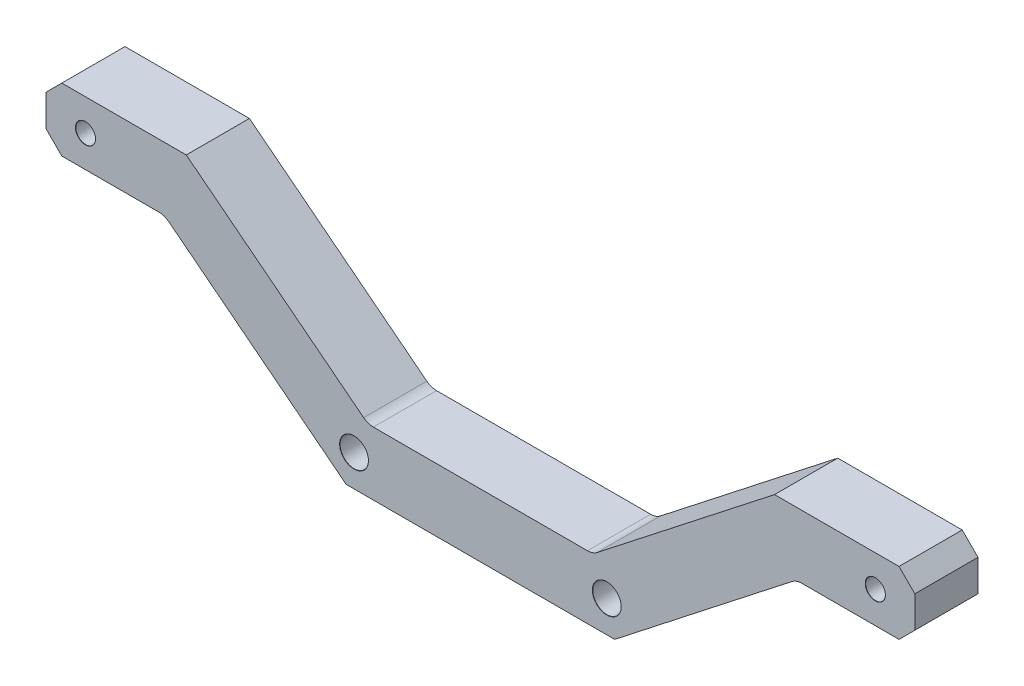
ISO-10303-21;
HEADER;
FILE_DESCRIPTION(('STEP AP214'),'2;1');
FILE_NAME('part.step','',(''),(''),'','','');
FILE_SCHEMA(('AUTOMOTIVE_DESIGN { 1 0 10303 214 1 1 1 1 }'));
ENDSEC;
DATA;
#1=APPLICATION_CONTEXT('core data for automotive mechanical design processes');
#2=APPLICATION_PROTOCOL_DEFINITION('international standard','automotive_design',2000,#1);
#3=PRODUCT_CONTEXT('',#1,'mechanical');
#4=PRODUCT('Part','Part','',(#3));
#5=PRODUCT_RELATED_PRODUCT_CATEGORY('part','',(#4));
#6=PRODUCT_DEFINITION_FORMATION('','',#4);
#7=PRODUCT_DEFINITION_CONTEXT('part definition',#1,'design');
#8=PRODUCT_DEFINITION('design','',#6,#7);
#9=PRODUCT_DEFINITION_SHAPE('','',#8);
#10=(LENGTH_UNIT() NAMED_UNIT(*) SI_UNIT(.MILLI.,.METRE.));
#11=(NAMED_UNIT(*) PLANE_ANGLE_UNIT() SI_UNIT($,.RADIAN.));
#12=(NAMED_UNIT(*) SI_UNIT($,.STERADIAN.) SOLID_ANGLE_UNIT());
#13=UNCERTAINTY_MEASURE_WITH_UNIT(LENGTH_MEASURE(1.E-05),#10,'distance_accuracy_value','');
#14=(GEOMETRIC_REPRESENTATION_CONTEXT(3) GLOBAL_UNCERTAINTY_ASSIGNED_CONTEXT((#13)) GLOBAL_UNIT_ASSIGNED_CONTEXT((#10,
#11,#12)) REPRESENTATION_CONTEXT('',''));
#15=CARTESIAN_POINT('',(0.,0.,0.));
#16=DIRECTION('',(0.,0.,1.));
#17=DIRECTION('',(1.,0.,0.));
#18=AXIS2_PLACEMENT_3D('',#15,#16,#17);
#19=CARTESIAN_POINT('',(0.,0.,0.));
#20=DIRECTION('',(0.,0.,-1.));
#21=DIRECTION('',(-1.,0.,0.));
#22=AXIS2_PLACEMENT_3D('',#19,#20,#21);
#23=PLANE('',#22);
#24=CARTESIAN_POINT('',(-16.,0.,0.));
#25=DIRECTION('',(0.,0.,1.));
#26=DIRECTION('',(1.,0.,0.));
#27=AXIS2_PLACEMENT_3D('',#24,#25,#26);
#28=CIRCLE('',#27,1.8);
#29=CARTESIAN_POINT('',(-14.2,0.,0.));
#30=VERTEX_POINT('',#29);
#31=EDGE_CURVE('E552',#30,#30,#28,.T.);
#32=ORIENTED_EDGE('',*,*,#31,.T.);
#33=EDGE_LOOP('',(#32));
#34=FACE_BOUND('',#33,.T.);
#35=CARTESIAN_POINT('',(16.,0.,0.));
#36=DIRECTION('',(0.,0.,1.));
#37=DIRECTION('',(1.,0.,0.));
#38=AXIS2_PLACEMENT_3D('',#35,#36,#37);
#39=CIRCLE('',#38,1.8);
#40=CARTESIAN_POINT('',(17.8,0.,0.));
#41=VERTEX_POINT('',#40);
#42=EDGE_CURVE('E540',#41,#41,#39,.T.);
#43=ORIENTED_EDGE('',*,*,#42,.T.);
#44=EDGE_LOOP('',(#43));
#45=FACE_BOUND('',#44,.T.);
#46=CARTESIAN_POINT('',(50.,18.,0.));
#47=DIRECTION('',(0.,0.,1.));
#48=DIRECTION('',(1.,0.,0.));
#49=AXIS2_PLACEMENT_3D('',#46,#47,#48);
#50=CIRCLE('',#49,1.25);
#51=CARTESIAN_POINT('',(51.25,18.,0.));
#52=VERTEX_POINT('',#51);
#53=EDGE_CURVE('E528',#52,#52,#50,.T.);
#54=ORIENTED_EDGE('',*,*,#53,.T.);
#55=EDGE_LOOP('',(#54));
#56=FACE_BOUND('',#55,.T.);
#57=DIRECTION('',(1.,0.,0.));
#58=VECTOR('',#57,1.);
#59=CARTESIAN_POINT('',(-55.,14.,0.));
#60=LINE('',#59,#58);
#61=CARTESIAN_POINT('',(-53.,14.,0.));
#62=VERTEX_POINT('',#61);
#63=CARTESIAN_POINT('',(-40.6895737481134,14.,0.));
#64=VERTEX_POINT('',#63);
#65=EDGE_CURVE('E252',#62,#64,#60,.T.);
#66=ORIENTED_EDGE('',*,*,#65,.F.);
#67=DIRECTION('',(0.707106781186545,-0.70710678118655,0.));
#68=VECTOR('',#67,1.);
#69=CARTESIAN_POINT('',(-19.5000000000002,-19.5,0.));
#70=LINE('',#69,#68);
#71=CARTESIAN_POINT('',(-55.,16.,0.));
#72=VERTEX_POINT('',#71);
#73=EDGE_CURVE('E300',#62,#72,#70,.F.);
#74=ORIENTED_EDGE('',*,*,#73,.T.);
#75=DIRECTION('',(0.,-1.,0.));
#76=VECTOR('',#75,1.);
#77=CARTESIAN_POINT('',(-55.,22.,0.));
#78=LINE('',#77,#76);
#79=CARTESIAN_POINT('',(-55.,20.,0.));
#80=VERTEX_POINT('',#79);
#81=EDGE_CURVE('E248',#80,#72,#78,.T.);
#82=ORIENTED_EDGE('',*,*,#81,.F.);
#83=DIRECTION('',(-0.70710678118655,-0.707106781186545,0.));
#84=VECTOR('',#83,1.);
#85=CARTESIAN_POINT('',(-37.4999999999998,37.5000000000001,0.));
#86=LINE('',#85,#84);
#87=CARTESIAN_POINT('',(-53.,22.,0.));
#88=VERTEX_POINT('',#87);
#89=EDGE_CURVE('E297',#80,#88,#86,.F.);
#90=ORIENTED_EDGE('',*,*,#89,.T.);
#91=DIRECTION('',(-1.,0.,0.));
#92=VECTOR('',#91,1.);
#93=CARTESIAN_POINT('',(-37.2417050075464,22.,0.));
#94=LINE('',#93,#92);
#95=CARTESIAN_POINT('',(-37.2417050075464,22.,0.));
#96=VERTEX_POINT('',#95);
#97=EDGE_CURVE('E245',#96,#88,#94,.T.);
#98=ORIENTED_EDGE('',*,*,#97,.F.);
#99=DIRECTION('',(-0.787505001007586,0.61630826165811,0.));
#100=VECTOR('',#99,1.);
#101=CARTESIAN_POINT('',(-14.2417050075465,4.,0.));
#102=LINE('',#101,#100);
#103=CARTESIAN_POINT('',(-14.7847477827493,4.42498999798483,0.));
#104=VERTEX_POINT('',#103);
#105=EDGE_CURVE('E191',#104,#96,#102,.T.);
#106=ORIENTED_EDGE('',*,*,#105,.F.);
#107=CARTESIAN_POINT('',(-13.5521312594331,6.,0.));
#108=DIRECTION('',(0.,0.,-1.));
#109=DIRECTION('',(-1.,0.,0.));
#110=AXIS2_PLACEMENT_3D('',#107,#108,#109);
#111=CIRCLE('',#110,2.);
#112=CARTESIAN_POINT('',(-13.5521312594331,4.,0.));
#113=VERTEX_POINT('',#112);
#114=EDGE_CURVE('E50',#104,#113,#111,.F.);
#115=ORIENTED_EDGE('',*,*,#114,.T.);
#116=DIRECTION('',(-1.,0.,0.));
#117=VECTOR('',#116,1.);
#118=CARTESIAN_POINT('',(-14.2417050075465,4.,0.));
#119=LINE('',#118,#117);
#120=CARTESIAN_POINT('',(13.5521312594331,4.,0.));
#121=VERTEX_POINT('',#120);
#122=EDGE_CURVE('E238',#121,#113,#119,.T.);
#123=ORIENTED_EDGE('',*,*,#122,.F.);
#124=CARTESIAN_POINT('',(13.5521312594331,6.,0.));
#125=DIRECTION('',(0.,0.,-1.));
#126=DIRECTION('',(-1.,0.,0.));
#127=AXIS2_PLACEMENT_3D('',#124,#125,#126);
#128=CIRCLE('',#127,2.);
#129=CARTESIAN_POINT('',(14.7847477827493,4.42498999798483,0.));
#130=VERTEX_POINT('',#129);
#131=EDGE_CURVE('E378',#121,#130,#128,.F.);
#132=ORIENTED_EDGE('',*,*,#131,.T.);
#133=DIRECTION('',(-0.787505001007586,-0.616308261658111,0.));
#134=VECTOR('',#133,1.);
#135=CARTESIAN_POINT('',(14.2417050075465,4.,0.));
#136=LINE('',#135,#134);
#137=CARTESIAN_POINT('',(37.2417050075464,22.,0.));
#138=VERTEX_POINT('',#137);
#139=EDGE_CURVE('E234',#138,#130,#136,.T.);
#140=ORIENTED_EDGE('',*,*,#139,.F.);
#141=DIRECTION('',(-1.,0.,0.));
#142=VECTOR('',#141,1.);
#143=CARTESIAN_POINT('',(37.2417050075464,22.,0.));
#144=LINE('',#143,#142);
#145=CARTESIAN_POINT('',(53.,22.,0.));
#146=VERTEX_POINT('',#145);
#147=EDGE_CURVE('E273',#146,#138,#144,.T.);
#148=ORIENTED_EDGE('',*,*,#147,.F.);
#149=DIRECTION('',(-0.707106781186545,0.70710678118655,0.));
#150=VECTOR('',#149,1.);
#151=CARTESIAN_POINT('',(37.5000000000002,37.4999999999999,0.));
#152=LINE('',#151,#150);
#153=CARTESIAN_POINT('',(55.,20.,0.));
#154=VERTEX_POINT('',#153);
#155=EDGE_CURVE('E290',#146,#154,#152,.F.);
#156=ORIENTED_EDGE('',*,*,#155,.T.);
#157=DIRECTION('',(0.,1.,0.));
#158=VECTOR('',#157,1.);
#159=CARTESIAN_POINT('',(55.,22.,0.));
#160=LINE('',#159,#158);
#161=CARTESIAN_POINT('',(55.,16.,0.));
#162=VERTEX_POINT('',#161);
#163=EDGE_CURVE('E269',#162,#154,#160,.T.);
#164=ORIENTED_EDGE('',*,*,#163,.F.);
#165=DIRECTION('',(0.70710678118655,0.707106781186545,0.));
#166=VECTOR('',#165,1.);
#167=CARTESIAN_POINT('',(19.4999999999998,-19.5,0.));
#168=LINE('',#167,#166);
#169=CARTESIAN_POINT('',(53.,14.,0.));
#170=VERTEX_POINT('',#169);
#171=EDGE_CURVE('E293',#162,#170,#168,.F.);
#172=ORIENTED_EDGE('',*,*,#171,.T.);
#173=DIRECTION('',(1.,0.,0.));
#174=VECTOR('',#173,1.);
#175=CARTESIAN_POINT('',(55.,14.,0.));
#176=LINE('',#175,#174);
#177=CARTESIAN_POINT('',(40.6895737481134,14.,0.));
#178=VERTEX_POINT('',#177);
#179=EDGE_CURVE('E266',#178,#170,#176,.T.);
#180=ORIENTED_EDGE('',*,*,#179,.F.);
#181=CARTESIAN_POINT('',(40.6895737481134,12.,0.));
#182=DIRECTION('',(0.,0.,-1.));
#183=DIRECTION('',(-1.,0.,0.));
#184=AXIS2_PLACEMENT_3D('',#181,#182,#183);
#185=CIRCLE('',#184,2.);
#186=CARTESIAN_POINT('',(39.4569572247972,13.5750100020152,0.));
#187=VERTEX_POINT('',#186);
#188=EDGE_CURVE('E372',#178,#187,#185,.F.);
#189=ORIENTED_EDGE('',*,*,#188,.T.);
#190=DIRECTION('',(0.787505001007586,0.616308261658111,0.));
#191=VECTOR('',#190,1.);
#192=CARTESIAN_POINT('',(40.,14.,0.));
#193=LINE('',#192,#191);
#194=CARTESIAN_POINT('',(17.,-4.,0.));
#195=VERTEX_POINT('',#194);
#196=EDGE_CURVE('E262',#195,#187,#193,.T.);
#197=ORIENTED_EDGE('',*,*,#196,.F.);
#198=DIRECTION('',(1.,0.,0.));
#199=VECTOR('',#198,1.);
#200=CARTESIAN_POINT('',(17.,-4.,0.));
#201=LINE('',#200,#199);
#202=CARTESIAN_POINT('',(-17.,-4.,0.));
#203=VERTEX_POINT('',#202);
#204=EDGE_CURVE('E259',#203,#195,#201,.T.);
#205=ORIENTED_EDGE('',*,*,#204,.F.);
#206=DIRECTION('',(0.787505001007586,-0.61630826165811,0.));
#207=VECTOR('',#206,1.);
#208=CARTESIAN_POINT('',(-40.,14.,0.));
#209=LINE('',#208,#207);
#210=CARTESIAN_POINT('',(-39.4569572247972,13.5750100020152,0.));
#211=VERTEX_POINT('',#210);
#212=EDGE_CURVE('E256',#211,#203,#209,.T.);
#213=ORIENTED_EDGE('',*,*,#212,.F.);
#214=CARTESIAN_POINT('',(-40.6895737481134,12.,0.));
#215=DIRECTION('',(0.,0.,-1.));
#216=DIRECTION('',(-1.,0.,0.));
#217=AXIS2_PLACEMENT_3D('',#214,#215,#216);
#218=CIRCLE('',#217,2.);
#219=EDGE_CURVE('E366',#211,#64,#218,.F.);
#220=ORIENTED_EDGE('',*,*,#219,.T.);
#221=EDGE_LOOP('',(#66,#74,#82,#90,#98,#106,#115,#123,#132,#140,#148,#156,#164,#172,#180,#189,
#197,#205,#213,#220));
#222=FACE_BOUND('',#221,.T.);
#223=CARTESIAN_POINT('',(-50.,18.,0.));
#224=DIRECTION('',(0.,0.,1.));
#225=DIRECTION('',(1.,0.,0.));
#226=AXIS2_PLACEMENT_3D('',#223,#224,#225);
#227=CIRCLE('',#226,1.25);
#228=CARTESIAN_POINT('',(-48.75,18.,0.));
#229=VERTEX_POINT('',#228);
#230=EDGE_CURVE('E239',#229,#229,#227,.T.);
#231=ORIENTED_EDGE('',*,*,#230,.T.);
#232=EDGE_LOOP('',(#231));
#233=FACE_BOUND('',#232,.T.);
#234=ADVANCED_FACE('F41',(#34,#45,#56,#222,#233),#23,.T.);
#235=CARTESIAN_POINT('',(0.,0.,8.));
#236=DIRECTION('',(0.,0.,-1.));
#237=DIRECTION('',(-1.,0.,0.));
#238=AXIS2_PLACEMENT_3D('',#235,#236,#237);
#239=PLANE('',#238);
#240=CARTESIAN_POINT('',(-16.,0.,8.));
#241=DIRECTION('',(0.,0.,1.));
#242=DIRECTION('',(1.,0.,0.));
#243=AXIS2_PLACEMENT_3D('',#240,#241,#242);
#244=CIRCLE('',#243,1.825);
#245=CARTESIAN_POINT('',(-14.175,0.,8.));
#246=VERTEX_POINT('',#245);
#247=EDGE_CURVE('E559',#246,#246,#244,.T.);
#248=ORIENTED_EDGE('',*,*,#247,.F.);
#249=EDGE_LOOP('',(#248));
#250=FACE_BOUND('',#249,.T.);
#251=CARTESIAN_POINT('',(16.,0.,8.));
#252=DIRECTION('',(0.,0.,1.));
#253=DIRECTION('',(1.,0.,0.));
#254=AXIS2_PLACEMENT_3D('',#251,#252,#253);
#255=CIRCLE('',#254,1.825);
#256=CARTESIAN_POINT('',(17.825,0.,8.));
#257=VERTEX_POINT('',#256);
#258=EDGE_CURVE('E548',#257,#257,#255,.T.);
#259=ORIENTED_EDGE('',*,*,#258,.F.);
#260=EDGE_LOOP('',(#259));
#261=FACE_BOUND('',#260,.T.);
#262=CARTESIAN_POINT('',(50.,18.,8.));
#263=DIRECTION('',(0.,0.,1.));
#264=DIRECTION('',(1.,0.,0.));
#265=AXIS2_PLACEMENT_3D('',#262,#263,#264);
#266=CIRCLE('',#265,1.275);
#267=CARTESIAN_POINT('',(51.275,18.,8.));
#268=VERTEX_POINT('',#267);
#269=EDGE_CURVE('E536',#268,#268,#266,.T.);
#270=ORIENTED_EDGE('',*,*,#269,.F.);
#271=EDGE_LOOP('',(#270));
#272=FACE_BOUND('',#271,.T.);
#273=CARTESIAN_POINT('',(-50.,18.,8.));
#274=DIRECTION('',(0.,0.,1.));
#275=DIRECTION('',(1.,0.,0.));
#276=AXIS2_PLACEMENT_3D('',#273,#274,#275);
#277=CIRCLE('',#276,1.275);
#278=CARTESIAN_POINT('',(-48.725,18.,8.));
#279=VERTEX_POINT('',#278);
#280=EDGE_CURVE('E524',#279,#279,#277,.T.);
#281=ORIENTED_EDGE('',*,*,#280,.F.);
#282=EDGE_LOOP('',(#281));
#283=FACE_BOUND('',#282,.T.);
#284=DIRECTION('',(0.,-1.,0.));
#285=VECTOR('',#284,1.);
#286=CARTESIAN_POINT('',(-55.,22.,8.));
#287=LINE('',#286,#285);
#288=CARTESIAN_POINT('',(-55.,20.,8.));
#289=VERTEX_POINT('',#288);
#290=CARTESIAN_POINT('',(-55.,16.,8.));
#291=VERTEX_POINT('',#290);
#292=EDGE_CURVE('E203',#289,#291,#287,.T.);
#293=ORIENTED_EDGE('',*,*,#292,.T.);
#294=DIRECTION('',(-0.707106781186545,0.70710678118655,0.));
#295=VECTOR('',#294,1.);
#296=CARTESIAN_POINT('',(-53.,14.,8.));
#297=LINE('',#296,#295);
#298=CARTESIAN_POINT('',(-53.,14.,8.));
#299=VERTEX_POINT('',#298);
#300=EDGE_CURVE('E319',#291,#299,#297,.F.);
#301=ORIENTED_EDGE('',*,*,#300,.T.);
#302=DIRECTION('',(1.,0.,0.));
#303=VECTOR('',#302,1.);
#304=CARTESIAN_POINT('',(-55.,14.,8.));
#305=LINE('',#304,#303);
#306=CARTESIAN_POINT('',(-40.6895737481134,14.,8.));
#307=VERTEX_POINT('',#306);
#308=EDGE_CURVE('E206',#299,#307,#305,.T.);
#309=ORIENTED_EDGE('',*,*,#308,.T.);
#310=CARTESIAN_POINT('',(-40.6895737481134,12.,8.));
#311=DIRECTION('',(0.,0.,-1.));
#312=DIRECTION('',(-1.,0.,0.));
#313=AXIS2_PLACEMENT_3D('',#310,#311,#312);
#314=CIRCLE('',#313,2.);
#315=CARTESIAN_POINT('',(-39.4569572247972,13.5750100020152,8.));
#316=VERTEX_POINT('',#315);
#317=EDGE_CURVE('E369',#307,#316,#314,.T.);
#318=ORIENTED_EDGE('',*,*,#317,.T.);
#319=DIRECTION('',(0.787505001007586,-0.61630826165811,0.));
#320=VECTOR('',#319,1.);
#321=CARTESIAN_POINT('',(-40.,14.,8.));
#322=LINE('',#321,#320);
#323=CARTESIAN_POINT('',(-17.,-4.,8.));
#324=VERTEX_POINT('',#323);
#325=EDGE_CURVE('E213',#316,#324,#322,.T.);
#326=ORIENTED_EDGE('',*,*,#325,.T.);
#327=DIRECTION('',(1.,0.,0.));
#328=VECTOR('',#327,1.);
#329=CARTESIAN_POINT('',(17.,-4.,8.));
#330=LINE('',#329,#328);
#331=CARTESIAN_POINT('',(17.,-4.,8.));
#332=VERTEX_POINT('',#331);
#333=EDGE_CURVE('E216',#324,#332,#330,.T.);
#334=ORIENTED_EDGE('',*,*,#333,.T.);
#335=DIRECTION('',(0.787505001007586,0.616308261658111,0.));
#336=VECTOR('',#335,1.);
#337=CARTESIAN_POINT('',(40.,14.,8.));
#338=LINE('',#337,#336);
#339=CARTESIAN_POINT('',(39.4569572247972,13.5750100020152,8.));
#340=VERTEX_POINT('',#339);
#341=EDGE_CURVE('E219',#332,#340,#338,.T.);
#342=ORIENTED_EDGE('',*,*,#341,.T.);
#343=CARTESIAN_POINT('',(40.6895737481134,12.,8.));
#344=DIRECTION('',(0.,0.,-1.));
#345=DIRECTION('',(-1.,0.,0.));
#346=AXIS2_PLACEMENT_3D('',#343,#344,#345);
#347=CIRCLE('',#346,2.);
#348=CARTESIAN_POINT('',(40.6895737481134,14.,8.));
#349=VERTEX_POINT('',#348);
#350=EDGE_CURVE('E375',#340,#349,#347,.T.);
#351=ORIENTED_EDGE('',*,*,#350,.T.);
#352=DIRECTION('',(1.,0.,0.));
#353=VECTOR('',#352,1.);
#354=CARTESIAN_POINT('',(55.,14.,8.));
#355=LINE('',#354,#353);
#356=CARTESIAN_POINT('',(53.,14.,8.));
#357=VERTEX_POINT('',#356);
#358=EDGE_CURVE('E223',#349,#357,#355,.T.);
#359=ORIENTED_EDGE('',*,*,#358,.T.);
#360=DIRECTION('',(-0.70710678118655,-0.707106781186545,0.));
#361=VECTOR('',#360,1.);
#362=CARTESIAN_POINT('',(55.,16.,8.));
#363=LINE('',#362,#361);
#364=CARTESIAN_POINT('',(55.,16.,8.));
#365=VERTEX_POINT('',#364);
#366=EDGE_CURVE('E313',#357,#365,#363,.F.);
#367=ORIENTED_EDGE('',*,*,#366,.T.);
#368=DIRECTION('',(0.,1.,0.));
#369=VECTOR('',#368,1.);
#370=CARTESIAN_POINT('',(55.,22.,8.));
#371=LINE('',#370,#369);
#372=CARTESIAN_POINT('',(55.,20.,8.));
#373=VERTEX_POINT('',#372);
#374=EDGE_CURVE('E226',#365,#373,#371,.T.);
#375=ORIENTED_EDGE('',*,*,#374,.T.);
#376=DIRECTION('',(0.707106781186545,-0.70710678118655,0.));
#377=VECTOR('',#376,1.);
#378=CARTESIAN_POINT('',(53.,22.,8.));
#379=LINE('',#378,#377);
#380=CARTESIAN_POINT('',(53.,22.,8.));
#381=VERTEX_POINT('',#380);
#382=EDGE_CURVE('E310',#373,#381,#379,.F.);
#383=ORIENTED_EDGE('',*,*,#382,.T.);
#384=DIRECTION('',(-1.,0.,0.));
#385=VECTOR('',#384,1.);
#386=CARTESIAN_POINT('',(37.2417050075464,22.,8.));
#387=LINE('',#386,#385);
#388=CARTESIAN_POINT('',(37.2417050075464,22.,8.));
#389=VERTEX_POINT('',#388);
#390=EDGE_CURVE('E230',#381,#389,#387,.T.);
#391=ORIENTED_EDGE('',*,*,#390,.T.);
#392=DIRECTION('',(-0.787505001007586,-0.616308261658111,0.));
#393=VECTOR('',#392,1.);
#394=CARTESIAN_POINT('',(14.2417050075465,4.,8.));
#395=LINE('',#394,#393);
#396=CARTESIAN_POINT('',(14.7847477827493,4.42498999798483,8.));
#397=VERTEX_POINT('',#396);
#398=EDGE_CURVE('E276',#389,#397,#395,.T.);
#399=ORIENTED_EDGE('',*,*,#398,.T.);
#400=CARTESIAN_POINT('',(13.5521312594331,6.,8.));
#401=DIRECTION('',(0.,0.,-1.));
#402=DIRECTION('',(-1.,0.,0.));
#403=AXIS2_PLACEMENT_3D('',#400,#401,#402);
#404=CIRCLE('',#403,2.);
#405=CARTESIAN_POINT('',(13.5521312594331,4.,8.));
#406=VERTEX_POINT('',#405);
#407=EDGE_CURVE('E381',#397,#406,#404,.T.);
#408=ORIENTED_EDGE('',*,*,#407,.T.);
#409=DIRECTION('',(-1.,0.,0.));
#410=VECTOR('',#409,1.);
#411=CARTESIAN_POINT('',(-14.2417050075465,4.,8.));
#412=LINE('',#411,#410);
#413=CARTESIAN_POINT('',(-13.5521312594331,4.,8.));
#414=VERTEX_POINT('',#413);
#415=EDGE_CURVE('E185',#406,#414,#412,.T.);
#416=ORIENTED_EDGE('',*,*,#415,.T.);
#417=CARTESIAN_POINT('',(-13.5521312594331,6.,8.));
#418=DIRECTION('',(0.,0.,-1.));
#419=DIRECTION('',(-1.,0.,0.));
#420=AXIS2_PLACEMENT_3D('',#417,#418,#419);
#421=CIRCLE('',#420,2.);
#422=CARTESIAN_POINT('',(-14.7847477827493,4.42498999798483,8.));
#423=VERTEX_POINT('',#422);
#424=EDGE_CURVE('E11',#414,#423,#421,.T.);
#425=ORIENTED_EDGE('',*,*,#424,.T.);
#426=DIRECTION('',(-0.787505001007586,0.61630826165811,0.));
#427=VECTOR('',#426,1.);
#428=CARTESIAN_POINT('',(-14.2417050075465,4.,8.));
#429=LINE('',#428,#427);
#430=CARTESIAN_POINT('',(-37.2417050075464,22.,8.));
#431=VERTEX_POINT('',#430);
#432=EDGE_CURVE('E176',#423,#431,#429,.T.);
#433=ORIENTED_EDGE('',*,*,#432,.T.);
#434=DIRECTION('',(-1.,0.,0.));
#435=VECTOR('',#434,1.);
#436=CARTESIAN_POINT('',(-37.2417050075464,22.,8.));
#437=LINE('',#436,#435);
#438=CARTESIAN_POINT('',(-53.,22.,8.));
#439=VERTEX_POINT('',#438);
#440=EDGE_CURVE('E181',#431,#439,#437,.T.);
#441=ORIENTED_EDGE('',*,*,#440,.T.);
#442=DIRECTION('',(0.70710678118655,0.707106781186545,0.));
#443=VECTOR('',#442,1.);
#444=CARTESIAN_POINT('',(-55.,20.,8.));
#445=LINE('',#444,#443);
#446=EDGE_CURVE('E316',#439,#289,#445,.F.);
#447=ORIENTED_EDGE('',*,*,#446,.T.);
#448=EDGE_LOOP('',(#293,#301,#309,#318,#326,#334,#342,#351,#359,#367,#375,#383,#391,#399,#408,
#416,#425,#433,#441,#447));
#449=FACE_BOUND('',#448,.T.);
#450=ADVANCED_FACE('F179',(#250,#261,#272,#283,#449),#239,.F.);
#451=CARTESIAN_POINT('',(14.2417050075465,4.,8.));
#452=DIRECTION('',(0.616308261658111,-0.787505001007586,0.));
#453=DIRECTION('',(0.787505001007586,0.616308261658111,0.));
#454=AXIS2_PLACEMENT_3D('',#451,#452,#453);
#455=PLANE('',#454);
#456=ORIENTED_EDGE('',*,*,#139,.T.);
#457=DIRECTION('',(0.,0.,-1.));
#458=VECTOR('',#457,1.);
#459=CARTESIAN_POINT('',(14.7847477827493,4.42498999798483,8.));
#460=LINE('',#459,#458);
#461=EDGE_CURVE('E360',#130,#397,#460,.F.);
#462=ORIENTED_EDGE('',*,*,#461,.T.);
#463=ORIENTED_EDGE('',*,*,#398,.F.);
#464=DIRECTION('',(0.,0.,-1.));
#465=VECTOR('',#464,1.);
#466=CARTESIAN_POINT('',(37.2417050075464,22.,8.));
#467=LINE('',#466,#465);
#468=EDGE_CURVE('E233',#389,#138,#467,.T.);
#469=ORIENTED_EDGE('',*,*,#468,.T.);
#470=EDGE_LOOP('',(#456,#462,#463,#469));
#471=FACE_BOUND('',#470,.T.);
#472=ADVANCED_FACE('F405',(#471),#455,.F.);
#473=CARTESIAN_POINT('',(-14.2417050075465,4.,8.));
#474=DIRECTION('',(0.,-1.,0.));
#475=DIRECTION('',(1.,0.,0.));
#476=AXIS2_PLACEMENT_3D('',#473,#474,#475);
#477=PLANE('',#476);
#478=ORIENTED_EDGE('',*,*,#415,.F.);
#479=DIRECTION('',(0.,0.,-1.));
#480=VECTOR('',#479,1.);
#481=CARTESIAN_POINT('',(13.5521312594331,4.,0.));
#482=LINE('',#481,#480);
#483=EDGE_CURVE('E356',#406,#121,#482,.T.);
#484=ORIENTED_EDGE('',*,*,#483,.T.);
#485=ORIENTED_EDGE('',*,*,#122,.T.);
#486=DIRECTION('',(0.,0.,-1.));
#487=VECTOR('',#486,1.);
#488=CARTESIAN_POINT('',(-13.5521312594331,4.,8.));
#489=LINE('',#488,#487);
#490=EDGE_CURVE('E353',#113,#414,#489,.F.);
#491=ORIENTED_EDGE('',*,*,#490,.T.);
#492=EDGE_LOOP('',(#478,#484,#485,#491));
#493=FACE_BOUND('',#492,.T.);
#494=ADVANCED_FACE('F390',(#493),#477,.F.);
#495=CARTESIAN_POINT('',(-14.2417050075465,4.,8.));
#496=DIRECTION('',(-0.61630826165811,-0.787505001007586,0.));
#497=DIRECTION('',(0.787505001007586,-0.616308261658111,0.));
#498=AXIS2_PLACEMENT_3D('',#495,#496,#497);
#499=PLANE('',#498);
#500=ORIENTED_EDGE('',*,*,#432,.F.);
#501=DIRECTION('',(0.,0.,-1.));
#502=VECTOR('',#501,1.);
#503=CARTESIAN_POINT('',(-14.7847477827493,4.42498999798483,0.));
#504=LINE('',#503,#502);
#505=EDGE_CURVE('E363',#423,#104,#504,.T.);
#506=ORIENTED_EDGE('',*,*,#505,.T.);
#507=ORIENTED_EDGE('',*,*,#105,.T.);
#508=DIRECTION('',(0.,0.,-1.));
#509=VECTOR('',#508,1.);
#510=CARTESIAN_POINT('',(-37.2417050075464,22.,8.));
#511=LINE('',#510,#509);
#512=EDGE_CURVE('E188',#431,#96,#511,.T.);
#513=ORIENTED_EDGE('',*,*,#512,.F.);
#514=EDGE_LOOP('',(#500,#506,#507,#513));
#515=FACE_BOUND('',#514,.T.);
#516=ADVANCED_FACE('F189',(#515),#499,.F.);
#517=CARTESIAN_POINT('',(-37.2417050075464,22.,8.));
#518=DIRECTION('',(0.,-1.,0.));
#519=DIRECTION('',(1.,0.,0.));
#520=AXIS2_PLACEMENT_3D('',#517,#518,#519);
#521=PLANE('',#520);
#522=ORIENTED_EDGE('',*,*,#97,.T.);
#523=DIRECTION('',(0.,0.,1.));
#524=VECTOR('',#523,1.);
#525=CARTESIAN_POINT('',(-53.,22.,8.));
#526=LINE('',#525,#524);
#527=EDGE_CURVE('E201',#88,#439,#526,.T.);
#528=ORIENTED_EDGE('',*,*,#527,.T.);
#529=ORIENTED_EDGE('',*,*,#440,.F.);
#530=ORIENTED_EDGE('',*,*,#512,.T.);
#531=EDGE_LOOP('',(#522,#528,#529,#530));
#532=FACE_BOUND('',#531,.T.);
#533=ADVANCED_FACE('F199',(#532),#521,.F.);
#534=CARTESIAN_POINT('',(-55.,22.,8.));
#535=DIRECTION('',(1.,0.,0.));
#536=DIRECTION('',(0.,0.,-1.));
#537=AXIS2_PLACEMENT_3D('',#534,#535,#536);
#538=PLANE('',#537);
#539=ORIENTED_EDGE('',*,*,#81,.T.);
#540=DIRECTION('',(0.,0.,1.));
#541=VECTOR('',#540,1.);
#542=CARTESIAN_POINT('',(-55.,16.,8.));
#543=LINE('',#542,#541);
#544=EDGE_CURVE('E307',#72,#291,#543,.T.);
#545=ORIENTED_EDGE('',*,*,#544,.T.);
#546=ORIENTED_EDGE('',*,*,#292,.F.);
#547=DIRECTION('',(0.,0.,-1.));
#548=VECTOR('',#547,1.);
#549=CARTESIAN_POINT('',(-55.,20.,8.));
#550=LINE('',#549,#548);
#551=EDGE_CURVE('E303',#289,#80,#550,.T.);
#552=ORIENTED_EDGE('',*,*,#551,.T.);
#553=EDGE_LOOP('',(#539,#545,#546,#552));
#554=FACE_BOUND('',#553,.T.);
#555=ADVANCED_FACE('F440',(#554),#538,.F.);
#556=CARTESIAN_POINT('',(-55.,14.,8.));
#557=DIRECTION('',(0.,1.,0.));
#558=DIRECTION('',(-1.,0.,0.));
#559=AXIS2_PLACEMENT_3D('',#556,#557,#558);
#560=PLANE('',#559);
#561=ORIENTED_EDGE('',*,*,#65,.T.);
#562=DIRECTION('',(0.,0.,-1.));
#563=VECTOR('',#562,1.);
#564=CARTESIAN_POINT('',(-40.6895737481134,14.,8.));
#565=LINE('',#564,#563);
#566=EDGE_CURVE('E343',#64,#307,#565,.F.);
#567=ORIENTED_EDGE('',*,*,#566,.T.);
#568=ORIENTED_EDGE('',*,*,#308,.F.);
#569=DIRECTION('',(0.,0.,-1.));
#570=VECTOR('',#569,1.);
#571=CARTESIAN_POINT('',(-53.,14.,8.));
#572=LINE('',#571,#570);
#573=EDGE_CURVE('E196',#299,#62,#572,.T.);
#574=ORIENTED_EDGE('',*,*,#573,.T.);
#575=EDGE_LOOP('',(#561,#567,#568,#574));
#576=FACE_BOUND('',#575,.T.);
#577=ADVANCED_FACE('F436',(#576),#560,.F.);
#578=CARTESIAN_POINT('',(-40.,14.,8.));
#579=DIRECTION('',(0.61630826165811,0.787505001007586,0.));
#580=DIRECTION('',(-0.787505001007586,0.61630826165811,0.));
#581=AXIS2_PLACEMENT_3D('',#578,#579,#580);
#582=PLANE('',#581);
#583=ORIENTED_EDGE('',*,*,#325,.F.);
#584=DIRECTION('',(0.,0.,-1.));
#585=VECTOR('',#584,1.);
#586=CARTESIAN_POINT('',(-39.4569572247972,13.5750100020152,0.));
#587=LINE('',#586,#585);
#588=EDGE_CURVE('E339',#316,#211,#587,.T.);
#589=ORIENTED_EDGE('',*,*,#588,.T.);
#590=ORIENTED_EDGE('',*,*,#212,.T.);
#591=DIRECTION('',(0.,0.,-1.));
#592=VECTOR('',#591,1.);
#593=CARTESIAN_POINT('',(-17.,-4.,8.));
#594=LINE('',#593,#592);
#595=EDGE_CURVE('E197',#324,#203,#594,.T.);
#596=ORIENTED_EDGE('',*,*,#595,.F.);
#597=EDGE_LOOP('',(#583,#589,#590,#596));
#598=FACE_BOUND('',#597,.T.);
#599=ADVANCED_FACE('F432',(#598),#582,.F.);
#600=CARTESIAN_POINT('',(17.,-4.,8.));
#601=DIRECTION('',(0.,1.,0.));
#602=DIRECTION('',(-1.,0.,0.));
#603=AXIS2_PLACEMENT_3D('',#600,#601,#602);
#604=PLANE('',#603);
#605=ORIENTED_EDGE('',*,*,#204,.T.);
#606=DIRECTION('',(0.,0.,-1.));
#607=VECTOR('',#606,1.);
#608=CARTESIAN_POINT('',(17.,-4.,8.));
#609=LINE('',#608,#607);
#610=EDGE_CURVE('E280',#332,#195,#609,.T.);
#611=ORIENTED_EDGE('',*,*,#610,.F.);
#612=ORIENTED_EDGE('',*,*,#333,.F.);
#613=ORIENTED_EDGE('',*,*,#595,.T.);
#614=EDGE_LOOP('',(#605,#611,#612,#613));
#615=FACE_BOUND('',#614,.T.);
#616=ADVANCED_FACE('F428',(#615),#604,.F.);
#617=CARTESIAN_POINT('',(40.,14.,8.));
#618=DIRECTION('',(-0.616308261658111,0.787505001007586,0.));
#619=DIRECTION('',(-0.787505001007586,-0.616308261658111,0.));
#620=AXIS2_PLACEMENT_3D('',#617,#618,#619);
#621=PLANE('',#620);
#622=ORIENTED_EDGE('',*,*,#196,.T.);
#623=DIRECTION('',(0.,0.,-1.));
#624=VECTOR('',#623,1.);
#625=CARTESIAN_POINT('',(39.4569572247972,13.5750100020152,8.));
#626=LINE('',#625,#624);
#627=EDGE_CURVE('E350',#187,#340,#626,.F.);
#628=ORIENTED_EDGE('',*,*,#627,.T.);
#629=ORIENTED_EDGE('',*,*,#341,.F.);
#630=ORIENTED_EDGE('',*,*,#610,.T.);
#631=EDGE_LOOP('',(#622,#628,#629,#630));
#632=FACE_BOUND('',#631,.T.);
#633=ADVANCED_FACE('F424',(#632),#621,.F.);
#634=CARTESIAN_POINT('',(55.,14.,8.));
#635=DIRECTION('',(0.,1.,0.));
#636=DIRECTION('',(-1.,0.,0.));
#637=AXIS2_PLACEMENT_3D('',#634,#635,#636);
#638=PLANE('',#637);
#639=ORIENTED_EDGE('',*,*,#358,.F.);
#640=DIRECTION('',(0.,0.,-1.));
#641=VECTOR('',#640,1.);
#642=CARTESIAN_POINT('',(40.6895737481134,14.,0.));
#643=LINE('',#642,#641);
#644=EDGE_CURVE('E346',#349,#178,#643,.T.);
#645=ORIENTED_EDGE('',*,*,#644,.T.);
#646=ORIENTED_EDGE('',*,*,#179,.T.);
#647=DIRECTION('',(0.,0.,1.));
#648=VECTOR('',#647,1.);
#649=CARTESIAN_POINT('',(53.,14.,8.));
#650=LINE('',#649,#648);
#651=EDGE_CURVE('E331',#170,#357,#650,.T.);
#652=ORIENTED_EDGE('',*,*,#651,.T.);
#653=EDGE_LOOP('',(#639,#645,#646,#652));
#654=FACE_BOUND('',#653,.T.);
#655=ADVANCED_FACE('F420',(#654),#638,.F.);
#656=CARTESIAN_POINT('',(55.,22.,8.));
#657=DIRECTION('',(-1.,0.,0.));
#658=DIRECTION('',(0.,0.,1.));
#659=AXIS2_PLACEMENT_3D('',#656,#657,#658);
#660=PLANE('',#659);
#661=ORIENTED_EDGE('',*,*,#374,.F.);
#662=DIRECTION('',(0.,0.,-1.));
#663=VECTOR('',#662,1.);
#664=CARTESIAN_POINT('',(55.,16.,8.));
#665=LINE('',#664,#663);
#666=EDGE_CURVE('E327',#365,#162,#665,.T.);
#667=ORIENTED_EDGE('',*,*,#666,.T.);
#668=ORIENTED_EDGE('',*,*,#163,.T.);
#669=DIRECTION('',(0.,0.,1.));
#670=VECTOR('',#669,1.);
#671=CARTESIAN_POINT('',(55.,20.,8.));
#672=LINE('',#671,#670);
#673=EDGE_CURVE('E324',#154,#373,#672,.T.);
#674=ORIENTED_EDGE('',*,*,#673,.T.);
#675=EDGE_LOOP('',(#661,#667,#668,#674));
#676=FACE_BOUND('',#675,.T.);
#677=ADVANCED_FACE('F416',(#676),#660,.F.);
#678=CARTESIAN_POINT('',(37.2417050075464,22.,8.));
#679=DIRECTION('',(0.,-1.,0.));
#680=DIRECTION('',(0.,0.,-1.));
#681=AXIS2_PLACEMENT_3D('',#678,#679,#680);
#682=PLANE('',#681);
#683=ORIENTED_EDGE('',*,*,#390,.F.);
#684=DIRECTION('',(0.,0.,-1.));
#685=VECTOR('',#684,1.);
#686=CARTESIAN_POINT('',(53.,22.,8.));
#687=LINE('',#686,#685);
#688=EDGE_CURVE('E335',#381,#146,#687,.T.);
#689=ORIENTED_EDGE('',*,*,#688,.T.);
#690=ORIENTED_EDGE('',*,*,#147,.T.);
#691=ORIENTED_EDGE('',*,*,#468,.F.);
#692=EDGE_LOOP('',(#683,#689,#690,#691));
#693=FACE_BOUND('',#692,.T.);
#694=ADVANCED_FACE('F412',(#693),#682,.F.);
#695=CARTESIAN_POINT('',(-50.,18.,8.));
#696=DIRECTION('',(0.,0.,1.));
#697=DIRECTION('',(1.,0.,0.));
#698=AXIS2_PLACEMENT_3D('',#695,#696,#697);
#699=CYLINDRICAL_SURFACE('',#698,1.25);
#700=ORIENTED_EDGE('',*,*,#230,.F.);
#701=EDGE_LOOP('',(#700));
#702=FACE_BOUND('',#701,.T.);
#703=CARTESIAN_POINT('',(-50.,18.,7.975));
#704=DIRECTION('',(0.,0.,1.));
#705=DIRECTION('',(1.,0.,0.));
#706=AXIS2_PLACEMENT_3D('',#703,#704,#705);
#707=CIRCLE('',#706,1.25);
#708=CARTESIAN_POINT('',(-48.75,18.,7.975));
#709=VERTEX_POINT('',#708);
#710=EDGE_CURVE('E520',#709,#709,#707,.T.);
#711=ORIENTED_EDGE('',*,*,#710,.T.);
#712=EDGE_LOOP('',(#711));
#713=FACE_BOUND('',#712,.T.);
#714=ADVANCED_FACE('F415',(#702,#713),#699,.F.);
#715=CARTESIAN_POINT('',(-50.,18.,8.));
#716=DIRECTION('',(0.,0.,1.));
#717=DIRECTION('',(1.,0.,0.));
#718=AXIS2_PLACEMENT_3D('',#715,#716,#717);
#719=CONICAL_SURFACE('',#718,1.275,0.785398163397344);
#720=ORIENTED_EDGE('',*,*,#710,.F.);
#721=EDGE_LOOP('',(#720));
#722=FACE_BOUND('',#721,.T.);
#723=ORIENTED_EDGE('',*,*,#280,.T.);
#724=EDGE_LOOP('',(#723));
#725=FACE_BOUND('',#724,.T.);
#726=ADVANCED_FACE('F571',(#722,#725),#719,.F.);
#727=CARTESIAN_POINT('',(50.,18.,8.));
#728=DIRECTION('',(0.,0.,1.));
#729=DIRECTION('',(1.,0.,0.));
#730=AXIS2_PLACEMENT_3D('',#727,#728,#729);
#731=CYLINDRICAL_SURFACE('',#730,1.25);
#732=ORIENTED_EDGE('',*,*,#53,.F.);
#733=EDGE_LOOP('',(#732));
#734=FACE_BOUND('',#733,.T.);
#735=CARTESIAN_POINT('',(50.,18.,7.975));
#736=DIRECTION('',(0.,0.,1.));
#737=DIRECTION('',(1.,0.,0.));
#738=AXIS2_PLACEMENT_3D('',#735,#736,#737);
#739=CIRCLE('',#738,1.25);
#740=CARTESIAN_POINT('',(51.25,18.,7.975));
#741=VERTEX_POINT('',#740);
#742=EDGE_CURVE('E532',#741,#741,#739,.T.);
#743=ORIENTED_EDGE('',*,*,#742,.T.);
#744=EDGE_LOOP('',(#743));
#745=FACE_BOUND('',#744,.T.);
#746=ADVANCED_FACE('F573',(#734,#745),#731,.F.);
#747=CARTESIAN_POINT('',(50.,18.,8.));
#748=DIRECTION('',(0.,0.,1.));
#749=DIRECTION('',(1.,0.,0.));
#750=AXIS2_PLACEMENT_3D('',#747,#748,#749);
#751=CONICAL_SURFACE('',#750,1.275,0.785398163397344);
#752=ORIENTED_EDGE('',*,*,#742,.F.);
#753=EDGE_LOOP('',(#752));
#754=FACE_BOUND('',#753,.T.);
#755=ORIENTED_EDGE('',*,*,#269,.T.);
#756=EDGE_LOOP('',(#755));
#757=FACE_BOUND('',#756,.T.);
#758=ADVANCED_FACE('F580',(#754,#757),#751,.F.);
#759=CARTESIAN_POINT('',(16.,0.,8.));
#760=DIRECTION('',(0.,0.,1.));
#761=DIRECTION('',(1.,0.,0.));
#762=AXIS2_PLACEMENT_3D('',#759,#760,#761);
#763=CYLINDRICAL_SURFACE('',#762,1.8);
#764=ORIENTED_EDGE('',*,*,#42,.F.);
#765=EDGE_LOOP('',(#764));
#766=FACE_BOUND('',#765,.T.);
#767=CARTESIAN_POINT('',(16.,0.,7.975));
#768=DIRECTION('',(0.,0.,1.));
#769=DIRECTION('',(1.,0.,0.));
#770=AXIS2_PLACEMENT_3D('',#767,#768,#769);
#771=CIRCLE('',#770,1.8);
#772=CARTESIAN_POINT('',(17.8,0.,7.975));
#773=VERTEX_POINT('',#772);
#774=EDGE_CURVE('E544',#773,#773,#771,.T.);
#775=ORIENTED_EDGE('',*,*,#774,.T.);
#776=EDGE_LOOP('',(#775));
#777=FACE_BOUND('',#776,.T.);
#778=ADVANCED_FACE('F588',(#766,#777),#763,.F.);
#779=CARTESIAN_POINT('',(16.,0.,8.));
#780=DIRECTION('',(0.,0.,1.));
#781=DIRECTION('',(1.,0.,0.));
#782=AXIS2_PLACEMENT_3D('',#779,#780,#781);
#783=CONICAL_SURFACE('',#782,1.825,0.785398163397448);
#784=ORIENTED_EDGE('',*,*,#774,.F.);
#785=EDGE_LOOP('',(#784));
#786=FACE_BOUND('',#785,.T.);
#787=ORIENTED_EDGE('',*,*,#258,.T.);
#788=EDGE_LOOP('',(#787));
#789=FACE_BOUND('',#788,.T.);
#790=ADVANCED_FACE('F592',(#786,#789),#783,.F.);
#791=CARTESIAN_POINT('',(-16.,0.,8.));
#792=DIRECTION('',(0.,0.,1.));
#793=DIRECTION('',(1.,0.,0.));
#794=AXIS2_PLACEMENT_3D('',#791,#792,#793);
#795=CYLINDRICAL_SURFACE('',#794,1.8);
#796=ORIENTED_EDGE('',*,*,#31,.F.);
#797=EDGE_LOOP('',(#796));
#798=FACE_BOUND('',#797,.T.);
#799=CARTESIAN_POINT('',(-16.,0.,7.975));
#800=DIRECTION('',(0.,0.,1.));
#801=DIRECTION('',(1.,0.,0.));
#802=AXIS2_PLACEMENT_3D('',#799,#800,#801);
#803=CIRCLE('',#802,1.8);
#804=CARTESIAN_POINT('',(-14.2,0.,7.975));
#805=VERTEX_POINT('',#804);
#806=EDGE_CURVE('E555',#805,#805,#803,.T.);
#807=ORIENTED_EDGE('',*,*,#806,.T.);
#808=EDGE_LOOP('',(#807));
#809=FACE_BOUND('',#808,.T.);
#810=ADVANCED_FACE('F596',(#798,#809),#795,.F.);
#811=CARTESIAN_POINT('',(-16.,0.,8.));
#812=DIRECTION('',(0.,0.,1.));
#813=DIRECTION('',(1.,0.,0.));
#814=AXIS2_PLACEMENT_3D('',#811,#812,#813);
#815=CONICAL_SURFACE('',#814,1.825,0.785398163397448);
#816=ORIENTED_EDGE('',*,*,#806,.F.);
#817=EDGE_LOOP('',(#816));
#818=FACE_BOUND('',#817,.T.);
#819=ORIENTED_EDGE('',*,*,#247,.T.);
#820=EDGE_LOOP('',(#819));
#821=FACE_BOUND('',#820,.T.);
#822=ADVANCED_FACE('F462',(#818,#821),#815,.F.);
#823=CARTESIAN_POINT('',(-53.,14.,8.));
#824=DIRECTION('',(0.70710678118655,0.707106781186545,0.));
#825=DIRECTION('',(0.,0.,-1.));
#826=AXIS2_PLACEMENT_3D('',#823,#824,#825);
#827=PLANE('',#826);
#828=ORIENTED_EDGE('',*,*,#300,.F.);
#829=ORIENTED_EDGE('',*,*,#544,.F.);
#830=ORIENTED_EDGE('',*,*,#73,.F.);
#831=ORIENTED_EDGE('',*,*,#573,.F.);
#832=EDGE_LOOP('',(#828,#829,#830,#831));
#833=FACE_BOUND('',#832,.T.);
#834=ADVANCED_FACE('F455',(#833),#827,.F.);
#835=CARTESIAN_POINT('',(-55.,20.,8.));
#836=DIRECTION('',(0.707106781186545,-0.70710678118655,0.));
#837=DIRECTION('',(0.,0.,-1.));
#838=AXIS2_PLACEMENT_3D('',#835,#836,#837);
#839=PLANE('',#838);
#840=ORIENTED_EDGE('',*,*,#446,.F.);
#841=ORIENTED_EDGE('',*,*,#527,.F.);
#842=ORIENTED_EDGE('',*,*,#89,.F.);
#843=ORIENTED_EDGE('',*,*,#551,.F.);
#844=EDGE_LOOP('',(#840,#841,#842,#843));
#845=FACE_BOUND('',#844,.T.);
#846=ADVANCED_FACE('F461',(#845),#839,.F.);
#847=CARTESIAN_POINT('',(55.,16.,8.));
#848=DIRECTION('',(-0.707106781186545,0.70710678118655,0.));
#849=DIRECTION('',(0.,0.,-1.));
#850=AXIS2_PLACEMENT_3D('',#847,#848,#849);
#851=PLANE('',#850);
#852=ORIENTED_EDGE('',*,*,#366,.F.);
#853=ORIENTED_EDGE('',*,*,#651,.F.);
#854=ORIENTED_EDGE('',*,*,#171,.F.);
#855=ORIENTED_EDGE('',*,*,#666,.F.);
#856=EDGE_LOOP('',(#852,#853,#854,#855));
#857=FACE_BOUND('',#856,.T.);
#858=ADVANCED_FACE('F469',(#857),#851,.F.);
#859=CARTESIAN_POINT('',(53.,22.,8.));
#860=DIRECTION('',(-0.70710678118655,-0.707106781186545,0.));
#861=DIRECTION('',(0.,0.,-1.));
#862=AXIS2_PLACEMENT_3D('',#859,#860,#861);
#863=PLANE('',#862);
#864=ORIENTED_EDGE('',*,*,#382,.F.);
#865=ORIENTED_EDGE('',*,*,#673,.F.);
#866=ORIENTED_EDGE('',*,*,#155,.F.);
#867=ORIENTED_EDGE('',*,*,#688,.F.);
#868=EDGE_LOOP('',(#864,#865,#866,#867));
#869=FACE_BOUND('',#868,.T.);
#870=ADVANCED_FACE('F476',(#869),#863,.F.);
#871=CARTESIAN_POINT('',(-40.6895737481134,12.,8.));
#872=DIRECTION('',(0.,0.,1.));
#873=DIRECTION('',(1.,0.,0.));
#874=AXIS2_PLACEMENT_3D('',#871,#872,#873);
#875=CYLINDRICAL_SURFACE('',#874,2.);
#876=ORIENTED_EDGE('',*,*,#317,.F.);
#877=ORIENTED_EDGE('',*,*,#566,.F.);
#878=ORIENTED_EDGE('',*,*,#219,.F.);
#879=ORIENTED_EDGE('',*,*,#588,.F.);
#880=EDGE_LOOP('',(#876,#877,#878,#879));
#881=FACE_BOUND('',#880,.T.);
#882=ADVANCED_FACE('F482',(#881),#875,.F.);
#883=CARTESIAN_POINT('',(40.6895737481134,12.,8.));
#884=DIRECTION('',(0.,0.,1.));
#885=DIRECTION('',(1.,0.,0.));
#886=AXIS2_PLACEMENT_3D('',#883,#884,#885);
#887=CYLINDRICAL_SURFACE('',#886,2.);
#888=ORIENTED_EDGE('',*,*,#350,.F.);
#889=ORIENTED_EDGE('',*,*,#627,.F.);
#890=ORIENTED_EDGE('',*,*,#188,.F.);
#891=ORIENTED_EDGE('',*,*,#644,.F.);
#892=EDGE_LOOP('',(#888,#889,#890,#891));
#893=FACE_BOUND('',#892,.T.);
#894=ADVANCED_FACE('F397',(#893),#887,.F.);
#895=CARTESIAN_POINT('',(13.5521312594331,6.,8.));
#896=DIRECTION('',(0.,0.,1.));
#897=DIRECTION('',(1.,0.,0.));
#898=AXIS2_PLACEMENT_3D('',#895,#896,#897);
#899=CYLINDRICAL_SURFACE('',#898,2.);
#900=ORIENTED_EDGE('',*,*,#407,.F.);
#901=ORIENTED_EDGE('',*,*,#461,.F.);
#902=ORIENTED_EDGE('',*,*,#131,.F.);
#903=ORIENTED_EDGE('',*,*,#483,.F.);
#904=EDGE_LOOP('',(#900,#901,#902,#903));
#905=FACE_BOUND('',#904,.T.);
#906=ADVANCED_FACE('F393',(#905),#899,.F.);
#907=CARTESIAN_POINT('',(-13.5521312594331,6.,8.));
#908=DIRECTION('',(0.,0.,1.));
#909=DIRECTION('',(1.,0.,0.));
#910=AXIS2_PLACEMENT_3D('',#907,#908,#909);
#911=CYLINDRICAL_SURFACE('',#910,2.);
#912=ORIENTED_EDGE('',*,*,#424,.F.);
#913=ORIENTED_EDGE('',*,*,#490,.F.);
#914=ORIENTED_EDGE('',*,*,#114,.F.);
#915=ORIENTED_EDGE('',*,*,#505,.F.);
#916=EDGE_LOOP('',(#912,#913,#914,#915));
#917=FACE_BOUND('',#916,.T.);
#918=ADVANCED_FACE('F43',(#917),#911,.F.);
#919=CLOSED_SHELL('',(#234,#450,#472,#494,#516,#533,#555,#577,#599,#616,#633,#655,#677,#694,
#714,#726,#746,#758,#778,#790,#810,#822,#834,#846,#858,#870,#882,#894,#906,#918));
#920=MANIFOLD_SOLID_BREP('B2',#919);
#921=ADVANCED_BREP_SHAPE_REPRESENTATION('',(#18,#920),#14);
#922=SHAPE_DEFINITION_REPRESENTATION(#9,#921);
ENDSEC;
END-ISO-10303-21;
